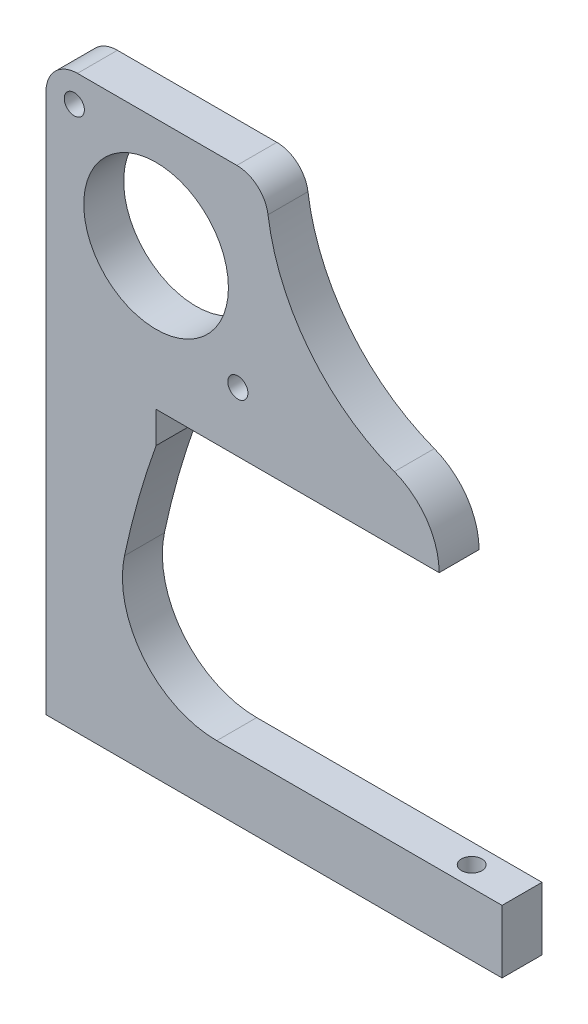
ISO-10303-21;
HEADER;
FILE_DESCRIPTION(('STEP AP214'),'2;1');
FILE_NAME('part.step','',(''),(''),'','','');
FILE_SCHEMA(('AUTOMOTIVE_DESIGN { 1 0 10303 214 1 1 1 1 }'));
ENDSEC;
DATA;
#1=APPLICATION_CONTEXT('core data for automotive mechanical design processes');
#2=APPLICATION_PROTOCOL_DEFINITION('international standard','automotive_design',2000,#1);
#3=PRODUCT_CONTEXT('',#1,'mechanical');
#4=PRODUCT('Part','Part','',(#3));
#5=PRODUCT_RELATED_PRODUCT_CATEGORY('part','',(#4));
#6=PRODUCT_DEFINITION_FORMATION('','',#4);
#7=PRODUCT_DEFINITION_CONTEXT('part definition',#1,'design');
#8=PRODUCT_DEFINITION('design','',#6,#7);
#9=PRODUCT_DEFINITION_SHAPE('','',#8);
#10=(LENGTH_UNIT() NAMED_UNIT(*) SI_UNIT(.MILLI.,.METRE.));
#11=(NAMED_UNIT(*) PLANE_ANGLE_UNIT() SI_UNIT($,.RADIAN.));
#12=(NAMED_UNIT(*) SI_UNIT($,.STERADIAN.) SOLID_ANGLE_UNIT());
#13=UNCERTAINTY_MEASURE_WITH_UNIT(LENGTH_MEASURE(1.E-05),#10,'distance_accuracy_value','');
#14=(GEOMETRIC_REPRESENTATION_CONTEXT(3) GLOBAL_UNCERTAINTY_ASSIGNED_CONTEXT((#13)) GLOBAL_UNIT_ASSIGNED_CONTEXT((#10,
#11,#12)) REPRESENTATION_CONTEXT('',''));
#15=CARTESIAN_POINT('',(0.,0.,0.));
#16=DIRECTION('',(0.,0.,1.));
#17=DIRECTION('',(1.,0.,0.));
#18=AXIS2_PLACEMENT_3D('',#15,#16,#17);
#19=CARTESIAN_POINT('',(0.,-40.,6.35));
#20=DIRECTION('',(0.,1.,0.));
#21=DIRECTION('',(0.,0.,1.));
#22=AXIS2_PLACEMENT_3D('',#19,#20,#21);
#23=PLANE('',#22);
#24=CARTESIAN_POINT('',(22.58,-40.,3.175));
#25=DIRECTION('',(0.,-1.,0.));
#26=DIRECTION('',(0.,0.,-1.));
#27=AXIS2_PLACEMENT_3D('',#24,#25,#26);
#28=CIRCLE('',#27,1.625);
#29=CARTESIAN_POINT('',(22.58,-40.,1.55));
#30=VERTEX_POINT('',#29);
#31=EDGE_CURVE('E187',#30,#30,#28,.T.);
#32=ORIENTED_EDGE('',*,*,#31,.F.);
#33=EDGE_LOOP('',(#32));
#34=FACE_BOUND('',#33,.T.);
#35=CARTESIAN_POINT('',(47.98,-40.,3.175));
#36=DIRECTION('',(0.,-1.,0.));
#37=DIRECTION('',(0.,0.,-1.));
#38=AXIS2_PLACEMENT_3D('',#35,#36,#37);
#39=CIRCLE('',#38,1.625);
#40=CARTESIAN_POINT('',(47.98,-40.,1.55));
#41=VERTEX_POINT('',#40);
#42=EDGE_CURVE('E214',#41,#41,#39,.T.);
#43=ORIENTED_EDGE('',*,*,#42,.F.);
#44=EDGE_LOOP('',(#43));
#45=FACE_BOUND('',#44,.T.);
#46=DIRECTION('',(1.,0.,0.));
#47=VECTOR('',#46,1.);
#48=CARTESIAN_POINT('',(0.,-40.,0.));
#49=LINE('',#48,#47);
#50=CARTESIAN_POINT('',(17.5,-40.,0.));
#51=VERTEX_POINT('',#50);
#52=CARTESIAN_POINT('',(62.5,-40.,0.));
#53=VERTEX_POINT('',#52);
#54=EDGE_CURVE('E273',#51,#53,#49,.T.);
#55=ORIENTED_EDGE('',*,*,#54,.T.);
#56=DIRECTION('',(0.,0.,-1.));
#57=VECTOR('',#56,1.);
#58=CARTESIAN_POINT('',(62.5,-40.,6.35));
#59=LINE('',#58,#57);
#60=CARTESIAN_POINT('',(62.5,-40.,6.35));
#61=VERTEX_POINT('',#60);
#62=EDGE_CURVE('E316',#61,#53,#59,.T.);
#63=ORIENTED_EDGE('',*,*,#62,.F.);
#64=DIRECTION('',(1.,0.,0.));
#65=VECTOR('',#64,1.);
#66=CARTESIAN_POINT('',(0.,-40.,6.35));
#67=LINE('',#66,#65);
#68=CARTESIAN_POINT('',(17.5,-40.,6.35));
#69=VERTEX_POINT('',#68);
#70=EDGE_CURVE('E236',#69,#61,#67,.T.);
#71=ORIENTED_EDGE('',*,*,#70,.F.);
#72=DIRECTION('',(0.,0.,-1.));
#73=VECTOR('',#72,1.);
#74=CARTESIAN_POINT('',(17.5,-40.,6.35));
#75=LINE('',#74,#73);
#76=EDGE_CURVE('E261',#69,#51,#75,.T.);
#77=ORIENTED_EDGE('',*,*,#76,.T.);
#78=EDGE_LOOP('',(#55,#63,#71,#77));
#79=FACE_BOUND('',#78,.T.);
#80=ADVANCED_FACE('F64',(#34,#45,#79),#23,.F.);
#81=CARTESIAN_POINT('',(51.409090909091,-40.,6.35));
#82=DIRECTION('',(0.,0.,-1.));
#83=DIRECTION('',(-1.,0.,0.));
#84=AXIS2_PLACEMENT_3D('',#81,#82,#83);
#85=CYLINDRICAL_SURFACE('',#84,11.090909090909);
#86=CARTESIAN_POINT('',(51.409090909091,-40.,0.));
#87=DIRECTION('',(0.,0.,1.));
#88=DIRECTION('',(1.,0.,0.));
#89=AXIS2_PLACEMENT_3D('',#86,#87,#88);
#90=CIRCLE('',#89,11.090909090909);
#91=CARTESIAN_POINT('',(55.3806366047746,-29.6445623342175,0.));
#92=VERTEX_POINT('',#91);
#93=EDGE_CURVE('E276',#53,#92,#90,.T.);
#94=ORIENTED_EDGE('',*,*,#93,.T.);
#95=DIRECTION('',(0.,0.,-1.));
#96=VECTOR('',#95,1.);
#97=CARTESIAN_POINT('',(55.3806366047746,-29.6445623342175,6.35));
#98=LINE('',#97,#96);
#99=CARTESIAN_POINT('',(55.3806366047746,-29.6445623342175,6.35));
#100=VERTEX_POINT('',#99);
#101=EDGE_CURVE('E312',#100,#92,#98,.T.);
#102=ORIENTED_EDGE('',*,*,#101,.F.);
#103=CARTESIAN_POINT('',(51.409090909091,-40.,6.35));
#104=DIRECTION('',(0.,0.,1.));
#105=DIRECTION('',(1.,0.,0.));
#106=AXIS2_PLACEMENT_3D('',#103,#104,#105);
#107=CIRCLE('',#106,11.090909090909);
#108=EDGE_CURVE('E240',#61,#100,#107,.T.);
#109=ORIENTED_EDGE('',*,*,#108,.F.);
#110=ORIENTED_EDGE('',*,*,#62,.T.);
#111=EDGE_LOOP('',(#94,#102,#109,#110));
#112=FACE_BOUND('',#111,.T.);
#113=ADVANCED_FACE('F370',(#112),#85,.T.);
#114=CARTESIAN_POINT('',(66.75,0.,6.35));
#115=DIRECTION('',(0.,0.,-1.));
#116=DIRECTION('',(-1.,0.,0.));
#117=AXIS2_PLACEMENT_3D('',#114,#115,#116);
#118=CYLINDRICAL_SURFACE('',#117,31.75);
#119=CARTESIAN_POINT('',(66.75,0.,0.));
#120=DIRECTION('',(0.,0.,1.));
#121=DIRECTION('',(1.,0.,0.));
#122=AXIS2_PLACEMENT_3D('',#119,#120,#121);
#123=CIRCLE('',#122,31.75);
#124=CARTESIAN_POINT('',(35.295231665988,-4.31972789115646,0.));
#125=VERTEX_POINT('',#124);
#126=EDGE_CURVE('E280',#125,#92,#123,.T.);
#127=ORIENTED_EDGE('',*,*,#126,.F.);
#128=DIRECTION('',(0.,0.,-1.));
#129=VECTOR('',#128,1.);
#130=CARTESIAN_POINT('',(35.295231665988,-4.31972789115646,6.35));
#131=LINE('',#130,#129);
#132=CARTESIAN_POINT('',(35.295231665988,-4.31972789115646,6.35));
#133=VERTEX_POINT('',#132);
#134=EDGE_CURVE('E11',#125,#133,#131,.F.);
#135=ORIENTED_EDGE('',*,*,#134,.T.);
#136=CARTESIAN_POINT('',(66.75,0.,6.35));
#137=DIRECTION('',(0.,0.,1.));
#138=DIRECTION('',(1.,0.,0.));
#139=AXIS2_PLACEMENT_3D('',#136,#137,#138);
#140=CIRCLE('',#139,31.75);
#141=EDGE_CURVE('E244',#133,#100,#140,.T.);
#142=ORIENTED_EDGE('',*,*,#141,.T.);
#143=ORIENTED_EDGE('',*,*,#101,.T.);
#144=EDGE_LOOP('',(#127,#135,#142,#143));
#145=FACE_BOUND('',#144,.T.);
#146=ADVANCED_FACE('F367',(#145),#118,.F.);
#147=CARTESIAN_POINT('',(0.,0.,6.35));
#148=DIRECTION('',(0.,1.,0.));
#149=DIRECTION('',(0.,0.,1.));
#150=AXIS2_PLACEMENT_3D('',#147,#148,#149);
#151=PLANE('',#150);
#152=DIRECTION('',(1.,0.,0.));
#153=VECTOR('',#152,1.);
#154=CARTESIAN_POINT('',(0.,0.,0.));
#155=LINE('',#154,#153);
#156=CARTESIAN_POINT('',(5.,0.,0.));
#157=VERTEX_POINT('',#156);
#158=CARTESIAN_POINT('',(30.3417248417341,0.,0.));
#159=VERTEX_POINT('',#158);
#160=EDGE_CURVE('E283',#157,#159,#155,.T.);
#161=ORIENTED_EDGE('',*,*,#160,.F.);
#162=DIRECTION('',(0.,0.,-1.));
#163=VECTOR('',#162,1.);
#164=CARTESIAN_POINT('',(5.,0.,6.35));
#165=LINE('',#164,#163);
#166=CARTESIAN_POINT('',(5.,0.,6.35));
#167=VERTEX_POINT('',#166);
#168=EDGE_CURVE('E346',#157,#167,#165,.F.);
#169=ORIENTED_EDGE('',*,*,#168,.T.);
#170=DIRECTION('',(1.,0.,0.));
#171=VECTOR('',#170,1.);
#172=CARTESIAN_POINT('',(0.,0.,6.35));
#173=LINE('',#172,#171);
#174=CARTESIAN_POINT('',(30.3417248417341,0.,6.35));
#175=VERTEX_POINT('',#174);
#176=EDGE_CURVE('E247',#167,#175,#173,.T.);
#177=ORIENTED_EDGE('',*,*,#176,.T.);
#178=DIRECTION('',(0.,0.,-1.));
#179=VECTOR('',#178,1.);
#180=CARTESIAN_POINT('',(30.3417248417341,0.,6.35));
#181=LINE('',#180,#179);
#182=EDGE_CURVE('E342',#175,#159,#181,.T.);
#183=ORIENTED_EDGE('',*,*,#182,.T.);
#184=EDGE_LOOP('',(#161,#169,#177,#183));
#185=FACE_BOUND('',#184,.T.);
#186=ADVANCED_FACE('F364',(#185),#151,.T.);
#187=CARTESIAN_POINT('',(0.,0.,6.35));
#188=DIRECTION('',(-1.,0.,0.));
#189=DIRECTION('',(0.,0.,1.));
#190=AXIS2_PLACEMENT_3D('',#187,#188,#189);
#191=PLANE('',#190);
#192=DIRECTION('',(0.,1.,0.));
#193=VECTOR('',#192,1.);
#194=CARTESIAN_POINT('',(0.,0.,6.35));
#195=LINE('',#194,#193);
#196=CARTESIAN_POINT('',(0.,-90.8,6.35));
#197=VERTEX_POINT('',#196);
#198=CARTESIAN_POINT('',(0.,-5.,6.35));
#199=VERTEX_POINT('',#198);
#200=EDGE_CURVE('E173',#197,#199,#195,.T.);
#201=ORIENTED_EDGE('',*,*,#200,.T.);
#202=DIRECTION('',(0.,0.,-1.));
#203=VECTOR('',#202,1.);
#204=CARTESIAN_POINT('',(0.,-5.,6.35));
#205=LINE('',#204,#203);
#206=CARTESIAN_POINT('',(0.,-5.,0.));
#207=VERTEX_POINT('',#206);
#208=EDGE_CURVE('E332',#199,#207,#205,.T.);
#209=ORIENTED_EDGE('',*,*,#208,.T.);
#210=DIRECTION('',(0.,1.,0.));
#211=VECTOR('',#210,1.);
#212=CARTESIAN_POINT('',(0.,0.,0.));
#213=LINE('',#212,#211);
#214=CARTESIAN_POINT('',(0.,-90.8,0.));
#215=VERTEX_POINT('',#214);
#216=EDGE_CURVE('E287',#215,#207,#213,.T.);
#217=ORIENTED_EDGE('',*,*,#216,.F.);
#218=DIRECTION('',(0.,0.,-1.));
#219=VECTOR('',#218,1.);
#220=CARTESIAN_POINT('',(0.,-90.8,6.35));
#221=LINE('',#220,#219);
#222=EDGE_CURVE('E309',#197,#215,#221,.T.);
#223=ORIENTED_EDGE('',*,*,#222,.F.);
#224=EDGE_LOOP('',(#201,#209,#217,#223));
#225=FACE_BOUND('',#224,.T.);
#226=ADVANCED_FACE('F357',(#225),#191,.T.);
#227=CARTESIAN_POINT('',(0.,-90.8,6.35));
#228=DIRECTION('',(0.,-1.,0.));
#229=DIRECTION('',(0.,0.,-1.));
#230=AXIS2_PLACEMENT_3D('',#227,#228,#229);
#231=PLANE('',#230);
#232=CARTESIAN_POINT('',(64.5,-90.8,3.175));
#233=DIRECTION('',(0.,-1.,0.));
#234=DIRECTION('',(0.,0.,-1.));
#235=AXIS2_PLACEMENT_3D('',#232,#233,#234);
#236=CIRCLE('',#235,1.625);
#237=CARTESIAN_POINT('',(64.5,-90.8,1.55));
#238=VERTEX_POINT('',#237);
#239=EDGE_CURVE('E656',#238,#238,#236,.T.);
#240=ORIENTED_EDGE('',*,*,#239,.F.);
#241=EDGE_LOOP('',(#240));
#242=FACE_BOUND('',#241,.T.);
#243=DIRECTION('',(-1.,0.,0.));
#244=VECTOR('',#243,1.);
#245=CARTESIAN_POINT('',(0.,-90.8,0.));
#246=LINE('',#245,#244);
#247=CARTESIAN_POINT('',(72.5,-90.8,0.));
#248=VERTEX_POINT('',#247);
#249=EDGE_CURVE('E182',#248,#215,#246,.T.);
#250=ORIENTED_EDGE('',*,*,#249,.F.);
#251=DIRECTION('',(0.,0.,-1.));
#252=VECTOR('',#251,1.);
#253=CARTESIAN_POINT('',(72.5,-90.8,6.35));
#254=LINE('',#253,#252);
#255=CARTESIAN_POINT('',(72.5,-90.8,6.35));
#256=VERTEX_POINT('',#255);
#257=EDGE_CURVE('E179',#256,#248,#254,.T.);
#258=ORIENTED_EDGE('',*,*,#257,.F.);
#259=DIRECTION('',(-1.,0.,0.));
#260=VECTOR('',#259,1.);
#261=CARTESIAN_POINT('',(0.,-90.8,6.35));
#262=LINE('',#261,#260);
#263=EDGE_CURVE('E166',#256,#197,#262,.T.);
#264=ORIENTED_EDGE('',*,*,#263,.T.);
#265=ORIENTED_EDGE('',*,*,#222,.T.);
#266=EDGE_LOOP('',(#250,#258,#264,#265));
#267=FACE_BOUND('',#266,.T.);
#268=ADVANCED_FACE('F180',(#242,#267),#231,.T.);
#269=CARTESIAN_POINT('',(0.,-80.8,6.35));
#270=DIRECTION('',(0.,-1.,0.));
#271=DIRECTION('',(1.,0.,0.));
#272=AXIS2_PLACEMENT_3D('',#269,#270,#271);
#273=PLANE('',#272);
#274=CARTESIAN_POINT('',(64.5,-80.8,3.175));
#275=DIRECTION('',(0.,-1.,0.));
#276=DIRECTION('',(1.,0.,0.));
#277=AXIS2_PLACEMENT_3D('',#274,#275,#276);
#278=CIRCLE('',#277,1.625);
#279=CARTESIAN_POINT('',(66.125,-80.8,3.175));
#280=VERTEX_POINT('',#279);
#281=EDGE_CURVE('E202',#280,#280,#278,.F.);
#282=ORIENTED_EDGE('',*,*,#281,.F.);
#283=EDGE_LOOP('',(#282));
#284=FACE_BOUND('',#283,.T.);
#285=DIRECTION('',(-1.,0.,0.));
#286=VECTOR('',#285,1.);
#287=CARTESIAN_POINT('',(0.,-80.8,0.));
#288=LINE('',#287,#286);
#289=CARTESIAN_POINT('',(72.5,-80.8,0.));
#290=VERTEX_POINT('',#289);
#291=CARTESIAN_POINT('',(27.1468631938929,-80.8,0.));
#292=VERTEX_POINT('',#291);
#293=EDGE_CURVE('E293',#290,#292,#288,.T.);
#294=ORIENTED_EDGE('',*,*,#293,.T.);
#295=DIRECTION('',(0.,0.,1.));
#296=VECTOR('',#295,1.);
#297=CARTESIAN_POINT('',(27.1468631938929,-80.8,6.35));
#298=LINE('',#297,#296);
#299=CARTESIAN_POINT('',(27.1468631938929,-80.8,6.35));
#300=VERTEX_POINT('',#299);
#301=EDGE_CURVE('E323',#292,#300,#298,.T.);
#302=ORIENTED_EDGE('',*,*,#301,.T.);
#303=DIRECTION('',(-1.,0.,0.));
#304=VECTOR('',#303,1.);
#305=CARTESIAN_POINT('',(0.,-80.8,6.35));
#306=LINE('',#305,#304);
#307=CARTESIAN_POINT('',(72.5,-80.8,6.35));
#308=VERTEX_POINT('',#307);
#309=EDGE_CURVE('E176',#308,#300,#306,.T.);
#310=ORIENTED_EDGE('',*,*,#309,.F.);
#311=DIRECTION('',(0.,0.,-1.));
#312=VECTOR('',#311,1.);
#313=CARTESIAN_POINT('',(72.5,-80.8,6.35));
#314=LINE('',#313,#312);
#315=EDGE_CURVE('E188',#308,#290,#314,.T.);
#316=ORIENTED_EDGE('',*,*,#315,.T.);
#317=EDGE_LOOP('',(#294,#302,#310,#316));
#318=FACE_BOUND('',#317,.T.);
#319=ADVANCED_FACE('F388',(#284,#318),#273,.F.);
#320=CARTESIAN_POINT('',(145.025979623825,-90.8,6.35));
#321=DIRECTION('',(0.,0.,-1.));
#322=DIRECTION('',(-1.,0.,0.));
#323=AXIS2_PLACEMENT_3D('',#320,#321,#322);
#324=CYLINDRICAL_SURFACE('',#323,135.500979623825);
#325=CARTESIAN_POINT('',(145.025979623825,-90.8,6.35));
#326=DIRECTION('',(0.,0.,1.));
#327=DIRECTION('',(1.,0.,0.));
#328=AXIS2_PLACEMENT_3D('',#325,#326,#327);
#329=CIRCLE('',#328,135.500979623825);
#330=CARTESIAN_POINT('',(12.4732335523013,-62.6879921045401,6.35));
#331=VERTEX_POINT('',#330);
#332=CARTESIAN_POINT('',(17.5,-45.,6.35));
#333=VERTEX_POINT('',#332);
#334=EDGE_CURVE('E254',#331,#333,#329,.F.);
#335=ORIENTED_EDGE('',*,*,#334,.F.);
#336=DIRECTION('',(0.,0.,-1.));
#337=VECTOR('',#336,1.);
#338=CARTESIAN_POINT('',(12.4732335523013,-62.6879921045401,6.35));
#339=LINE('',#338,#337);
#340=CARTESIAN_POINT('',(12.4732335523013,-62.6879921045401,0.));
#341=VERTEX_POINT('',#340);
#342=EDGE_CURVE('E320',#331,#341,#339,.T.);
#343=ORIENTED_EDGE('',*,*,#342,.T.);
#344=CARTESIAN_POINT('',(145.025979623825,-90.8,0.));
#345=DIRECTION('',(0.,0.,1.));
#346=DIRECTION('',(1.,0.,0.));
#347=AXIS2_PLACEMENT_3D('',#344,#345,#346);
#348=CIRCLE('',#347,135.500979623825);
#349=CARTESIAN_POINT('',(17.5,-45.,0.));
#350=VERTEX_POINT('',#349);
#351=EDGE_CURVE('E297',#341,#350,#348,.F.);
#352=ORIENTED_EDGE('',*,*,#351,.T.);
#353=DIRECTION('',(0.,0.,-1.));
#354=VECTOR('',#353,1.);
#355=CARTESIAN_POINT('',(17.5,-45.,6.35));
#356=LINE('',#355,#354);
#357=EDGE_CURVE('E305',#333,#350,#356,.T.);
#358=ORIENTED_EDGE('',*,*,#357,.F.);
#359=EDGE_LOOP('',(#335,#343,#352,#358));
#360=FACE_BOUND('',#359,.T.);
#361=ADVANCED_FACE('F383',(#360),#324,.F.);
#362=CARTESIAN_POINT('',(30.5,-30.5,6.35));
#363=DIRECTION('',(0.,0.,-1.));
#364=DIRECTION('',(-1.,0.,0.));
#365=AXIS2_PLACEMENT_3D('',#362,#363,#364);
#366=CYLINDRICAL_SURFACE('',#365,1.6002);
#367=CARTESIAN_POINT('',(30.5,-30.5,6.35));
#368=DIRECTION('',(0.,0.,1.));
#369=DIRECTION('',(1.,0.,0.));
#370=AXIS2_PLACEMENT_3D('',#367,#368,#369);
#371=CIRCLE('',#370,1.6002);
#372=CARTESIAN_POINT('',(32.1002,-30.5,6.35));
#373=VERTEX_POINT('',#372);
#374=EDGE_CURVE('E232',#373,#373,#371,.T.);
#375=ORIENTED_EDGE('',*,*,#374,.T.);
#376=EDGE_LOOP('',(#375));
#377=FACE_BOUND('',#376,.T.);
#378=CARTESIAN_POINT('',(30.5,-30.5,0.));
#379=DIRECTION('',(0.,0.,1.));
#380=DIRECTION('',(1.,0.,0.));
#381=AXIS2_PLACEMENT_3D('',#378,#379,#380);
#382=CIRCLE('',#381,1.6002);
#383=CARTESIAN_POINT('',(32.1002,-30.5,0.));
#384=VERTEX_POINT('',#383);
#385=EDGE_CURVE('E269',#384,#384,#382,.T.);
#386=ORIENTED_EDGE('',*,*,#385,.F.);
#387=EDGE_LOOP('',(#386));
#388=FACE_BOUND('',#387,.T.);
#389=ADVANCED_FACE('F401',(#377,#388),#366,.F.);
#390=CARTESIAN_POINT('',(17.5,-17.5,6.35));
#391=DIRECTION('',(0.,0.,-1.));
#392=DIRECTION('',(-1.,0.,0.));
#393=AXIS2_PLACEMENT_3D('',#390,#391,#392);
#394=CYLINDRICAL_SURFACE('',#393,11.5);
#395=CARTESIAN_POINT('',(17.5,-17.5,6.35));
#396=DIRECTION('',(0.,0.,1.));
#397=DIRECTION('',(1.,0.,0.));
#398=AXIS2_PLACEMENT_3D('',#395,#396,#397);
#399=CIRCLE('',#398,11.5);
#400=CARTESIAN_POINT('',(29.,-17.5,6.35));
#401=VERTEX_POINT('',#400);
#402=EDGE_CURVE('E227',#401,#401,#399,.T.);
#403=ORIENTED_EDGE('',*,*,#402,.T.);
#404=EDGE_LOOP('',(#403));
#405=FACE_BOUND('',#404,.T.);
#406=CARTESIAN_POINT('',(17.5,-17.5,0.));
#407=DIRECTION('',(0.,0.,1.));
#408=DIRECTION('',(1.,0.,0.));
#409=AXIS2_PLACEMENT_3D('',#406,#407,#408);
#410=CIRCLE('',#409,11.5);
#411=CARTESIAN_POINT('',(29.,-17.5,0.));
#412=VERTEX_POINT('',#411);
#413=EDGE_CURVE('E265',#412,#412,#410,.T.);
#414=ORIENTED_EDGE('',*,*,#413,.F.);
#415=EDGE_LOOP('',(#414));
#416=FACE_BOUND('',#415,.T.);
#417=ADVANCED_FACE('F404',(#405,#416),#394,.F.);
#418=CARTESIAN_POINT('',(4.5,-4.5,6.35));
#419=DIRECTION('',(0.,0.,-1.));
#420=DIRECTION('',(-1.,0.,0.));
#421=AXIS2_PLACEMENT_3D('',#418,#419,#420);
#422=CYLINDRICAL_SURFACE('',#421,1.6002);
#423=CARTESIAN_POINT('',(4.5,-4.5,6.35));
#424=DIRECTION('',(0.,0.,1.));
#425=DIRECTION('',(1.,0.,0.));
#426=AXIS2_PLACEMENT_3D('',#423,#424,#425);
#427=CIRCLE('',#426,1.6002);
#428=CARTESIAN_POINT('',(6.1002,-4.5,6.35));
#429=VERTEX_POINT('',#428);
#430=EDGE_CURVE('E223',#429,#429,#427,.T.);
#431=ORIENTED_EDGE('',*,*,#430,.T.);
#432=EDGE_LOOP('',(#431));
#433=FACE_BOUND('',#432,.T.);
#434=CARTESIAN_POINT('',(4.5,-4.5,0.));
#435=DIRECTION('',(0.,0.,1.));
#436=DIRECTION('',(1.,0.,0.));
#437=AXIS2_PLACEMENT_3D('',#434,#435,#436);
#438=CIRCLE('',#437,1.6002);
#439=CARTESIAN_POINT('',(6.1002,-4.5,0.));
#440=VERTEX_POINT('',#439);
#441=EDGE_CURVE('E222',#440,#440,#438,.T.);
#442=ORIENTED_EDGE('',*,*,#441,.F.);
#443=EDGE_LOOP('',(#442));
#444=FACE_BOUND('',#443,.T.);
#445=ADVANCED_FACE('F408',(#433,#444),#422,.F.);
#446=CARTESIAN_POINT('',(17.5,0.,6.35));
#447=DIRECTION('',(1.,0.,0.));
#448=DIRECTION('',(0.,1.,0.));
#449=AXIS2_PLACEMENT_3D('',#446,#447,#448);
#450=PLANE('',#449);
#451=DIRECTION('',(0.,-1.,0.));
#452=VECTOR('',#451,1.);
#453=CARTESIAN_POINT('',(17.5,0.,0.));
#454=LINE('',#453,#452);
#455=EDGE_CURVE('E228',#51,#350,#454,.T.);
#456=ORIENTED_EDGE('',*,*,#455,.F.);
#457=ORIENTED_EDGE('',*,*,#76,.F.);
#458=DIRECTION('',(0.,-1.,0.));
#459=VECTOR('',#458,1.);
#460=CARTESIAN_POINT('',(17.5,0.,6.35));
#461=LINE('',#460,#459);
#462=EDGE_CURVE('E257',#69,#333,#461,.T.);
#463=ORIENTED_EDGE('',*,*,#462,.T.);
#464=ORIENTED_EDGE('',*,*,#357,.T.);
#465=EDGE_LOOP('',(#456,#457,#463,#464));
#466=FACE_BOUND('',#465,.T.);
#467=ADVANCED_FACE('F377',(#466),#450,.T.);
#468=CARTESIAN_POINT('',(0.,0.,6.35));
#469=DIRECTION('',(0.,0.,1.));
#470=DIRECTION('',(1.,0.,0.));
#471=AXIS2_PLACEMENT_3D('',#468,#469,#470);
#472=PLANE('',#471);
#473=ORIENTED_EDGE('',*,*,#430,.F.);
#474=EDGE_LOOP('',(#473));
#475=FACE_BOUND('',#474,.T.);
#476=ORIENTED_EDGE('',*,*,#402,.F.);
#477=EDGE_LOOP('',(#476));
#478=FACE_BOUND('',#477,.T.);
#479=ORIENTED_EDGE('',*,*,#374,.F.);
#480=EDGE_LOOP('',(#479));
#481=FACE_BOUND('',#480,.T.);
#482=ORIENTED_EDGE('',*,*,#176,.F.);
#483=CARTESIAN_POINT('',(5.,-5.,6.35));
#484=DIRECTION('',(0.,0.,1.));
#485=DIRECTION('',(1.,0.,0.));
#486=AXIS2_PLACEMENT_3D('',#483,#484,#485);
#487=CIRCLE('',#486,5.);
#488=EDGE_CURVE('E73',#167,#199,#487,.T.);
#489=ORIENTED_EDGE('',*,*,#488,.T.);
#490=ORIENTED_EDGE('',*,*,#200,.F.);
#491=ORIENTED_EDGE('',*,*,#263,.F.);
#492=DIRECTION('',(0.,-1.,0.));
#493=VECTOR('',#492,1.);
#494=CARTESIAN_POINT('',(72.5,0.,6.35));
#495=LINE('',#494,#493);
#496=EDGE_CURVE('E171',#308,#256,#495,.T.);
#497=ORIENTED_EDGE('',*,*,#496,.F.);
#498=ORIENTED_EDGE('',*,*,#309,.T.);
#499=CARTESIAN_POINT('',(27.1468631938929,-65.8,6.35));
#500=DIRECTION('',(0.,0.,1.));
#501=DIRECTION('',(1.,0.,0.));
#502=AXIS2_PLACEMENT_3D('',#499,#500,#501);
#503=CIRCLE('',#502,15.);
#504=EDGE_CURVE('E329',#300,#331,#503,.F.);
#505=ORIENTED_EDGE('',*,*,#504,.T.);
#506=ORIENTED_EDGE('',*,*,#334,.T.);
#507=ORIENTED_EDGE('',*,*,#462,.F.);
#508=ORIENTED_EDGE('',*,*,#70,.T.);
#509=ORIENTED_EDGE('',*,*,#108,.T.);
#510=ORIENTED_EDGE('',*,*,#141,.F.);
#511=CARTESIAN_POINT('',(30.3417248417341,-5.,6.35));
#512=DIRECTION('',(0.,0.,1.));
#513=DIRECTION('',(1.,0.,0.));
#514=AXIS2_PLACEMENT_3D('',#511,#512,#513);
#515=CIRCLE('',#514,5.);
#516=EDGE_CURVE('E85',#133,#175,#515,.T.);
#517=ORIENTED_EDGE('',*,*,#516,.T.);
#518=EDGE_LOOP('',(#482,#489,#490,#491,#497,#498,#505,#506,#507,#508,#509,#510,#517));
#519=FACE_BOUND('',#518,.T.);
#520=ADVANCED_FACE('F168',(#475,#478,#481,#519),#472,.T.);
#521=CARTESIAN_POINT('',(0.,0.,0.));
#522=DIRECTION('',(0.,0.,1.));
#523=DIRECTION('',(1.,0.,0.));
#524=AXIS2_PLACEMENT_3D('',#521,#522,#523);
#525=PLANE('',#524);
#526=ORIENTED_EDGE('',*,*,#441,.T.);
#527=EDGE_LOOP('',(#526));
#528=FACE_BOUND('',#527,.T.);
#529=ORIENTED_EDGE('',*,*,#413,.T.);
#530=EDGE_LOOP('',(#529));
#531=FACE_BOUND('',#530,.T.);
#532=ORIENTED_EDGE('',*,*,#385,.T.);
#533=EDGE_LOOP('',(#532));
#534=FACE_BOUND('',#533,.T.);
#535=ORIENTED_EDGE('',*,*,#216,.T.);
#536=CARTESIAN_POINT('',(5.,-5.,0.));
#537=DIRECTION('',(0.,0.,1.));
#538=DIRECTION('',(1.,0.,0.));
#539=AXIS2_PLACEMENT_3D('',#536,#537,#538);
#540=CIRCLE('',#539,5.);
#541=EDGE_CURVE('E339',#207,#157,#540,.F.);
#542=ORIENTED_EDGE('',*,*,#541,.T.);
#543=ORIENTED_EDGE('',*,*,#160,.T.);
#544=CARTESIAN_POINT('',(30.3417248417341,-5.,0.));
#545=DIRECTION('',(0.,0.,1.));
#546=DIRECTION('',(1.,0.,0.));
#547=AXIS2_PLACEMENT_3D('',#544,#545,#546);
#548=CIRCLE('',#547,5.);
#549=EDGE_CURVE('E336',#159,#125,#548,.F.);
#550=ORIENTED_EDGE('',*,*,#549,.T.);
#551=ORIENTED_EDGE('',*,*,#126,.T.);
#552=ORIENTED_EDGE('',*,*,#93,.F.);
#553=ORIENTED_EDGE('',*,*,#54,.F.);
#554=ORIENTED_EDGE('',*,*,#455,.T.);
#555=ORIENTED_EDGE('',*,*,#351,.F.);
#556=CARTESIAN_POINT('',(27.1468631938929,-65.8,0.));
#557=DIRECTION('',(0.,0.,1.));
#558=DIRECTION('',(1.,0.,0.));
#559=AXIS2_PLACEMENT_3D('',#556,#557,#558);
#560=CIRCLE('',#559,15.);
#561=EDGE_CURVE('E326',#341,#292,#560,.T.);
#562=ORIENTED_EDGE('',*,*,#561,.T.);
#563=ORIENTED_EDGE('',*,*,#293,.F.);
#564=DIRECTION('',(0.,-1.,0.));
#565=VECTOR('',#564,1.);
#566=CARTESIAN_POINT('',(72.5,0.,0.));
#567=LINE('',#566,#565);
#568=EDGE_CURVE('E194',#290,#248,#567,.T.);
#569=ORIENTED_EDGE('',*,*,#568,.T.);
#570=ORIENTED_EDGE('',*,*,#249,.T.);
#571=EDGE_LOOP('',(#535,#542,#543,#550,#551,#552,#553,#554,#555,#562,#563,#569,#570));
#572=FACE_BOUND('',#571,.T.);
#573=ADVANCED_FACE('F362',(#528,#531,#534,#572),#525,.F.);
#574=CARTESIAN_POINT('',(47.98,-30.,3.175));
#575=DIRECTION('',(0.,-1.,0.));
#576=DIRECTION('',(0.,0.,-1.));
#577=AXIS2_PLACEMENT_3D('',#574,#575,#576);
#578=CONICAL_SURFACE('',#577,1.62499999999999,1.02974425867665);
#579=CARTESIAN_POINT('',(47.98,-29.0236014940802,3.175));
#580=VERTEX_POINT('',#579);
#581=VERTEX_LOOP('',#580);
#582=FACE_BOUND('',#581,.T.);
#583=CARTESIAN_POINT('',(47.98,-30.,3.175));
#584=DIRECTION('',(0.,-1.,0.));
#585=DIRECTION('',(0.,0.,-1.));
#586=AXIS2_PLACEMENT_3D('',#583,#584,#585);
#587=CIRCLE('',#586,1.62499999999999);
#588=CARTESIAN_POINT('',(47.98,-30.,1.55000000000001));
#589=VERTEX_POINT('',#588);
#590=EDGE_CURVE('E218',#589,#589,#587,.T.);
#591=ORIENTED_EDGE('',*,*,#590,.T.);
#592=EDGE_LOOP('',(#591));
#593=FACE_BOUND('',#592,.T.);
#594=ADVANCED_FACE('F438',(#582,#593),#578,.F.);
#595=CARTESIAN_POINT('',(47.98,-40.,3.175));
#596=DIRECTION('',(0.,-1.,0.));
#597=DIRECTION('',(0.,0.,-1.));
#598=AXIS2_PLACEMENT_3D('',#595,#596,#597);
#599=CYLINDRICAL_SURFACE('',#598,1.625);
#600=ORIENTED_EDGE('',*,*,#590,.F.);
#601=EDGE_LOOP('',(#600));
#602=FACE_BOUND('',#601,.T.);
#603=ORIENTED_EDGE('',*,*,#42,.T.);
#604=EDGE_LOOP('',(#603));
#605=FACE_BOUND('',#604,.T.);
#606=ADVANCED_FACE('F434',(#602,#605),#599,.F.);
#607=CARTESIAN_POINT('',(22.58,-30.,3.175));
#608=DIRECTION('',(0.,-1.,0.));
#609=DIRECTION('',(0.,0.,-1.));
#610=AXIS2_PLACEMENT_3D('',#607,#608,#609);
#611=CONICAL_SURFACE('',#610,1.625,1.02974425867665);
#612=CARTESIAN_POINT('',(22.58,-29.0236014940802,3.175));
#613=VERTEX_POINT('',#612);
#614=VERTEX_LOOP('',#613);
#615=FACE_BOUND('',#614,.T.);
#616=CARTESIAN_POINT('',(22.58,-30.,3.175));
#617=DIRECTION('',(0.,-1.,0.));
#618=DIRECTION('',(0.,0.,-1.));
#619=AXIS2_PLACEMENT_3D('',#616,#617,#618);
#620=CIRCLE('',#619,1.625);
#621=CARTESIAN_POINT('',(22.58,-30.,1.55));
#622=VERTEX_POINT('',#621);
#623=EDGE_CURVE('E210',#622,#622,#620,.T.);
#624=ORIENTED_EDGE('',*,*,#623,.T.);
#625=EDGE_LOOP('',(#624));
#626=FACE_BOUND('',#625,.T.);
#627=ADVANCED_FACE('F430',(#615,#626),#611,.F.);
#628=CARTESIAN_POINT('',(22.58,-40.,3.175));
#629=DIRECTION('',(0.,-1.,0.));
#630=DIRECTION('',(0.,0.,-1.));
#631=AXIS2_PLACEMENT_3D('',#628,#629,#630);
#632=CYLINDRICAL_SURFACE('',#631,1.625);
#633=ORIENTED_EDGE('',*,*,#623,.F.);
#634=EDGE_LOOP('',(#633));
#635=FACE_BOUND('',#634,.T.);
#636=ORIENTED_EDGE('',*,*,#31,.T.);
#637=EDGE_LOOP('',(#636));
#638=FACE_BOUND('',#637,.T.);
#639=ADVANCED_FACE('F414',(#635,#638),#632,.F.);
#640=CARTESIAN_POINT('',(27.1468631938929,-65.8,6.35));
#641=DIRECTION('',(0.,0.,-1.));
#642=DIRECTION('',(-1.,0.,0.));
#643=AXIS2_PLACEMENT_3D('',#640,#641,#642);
#644=CYLINDRICAL_SURFACE('',#643,15.);
#645=ORIENTED_EDGE('',*,*,#504,.F.);
#646=ORIENTED_EDGE('',*,*,#301,.F.);
#647=ORIENTED_EDGE('',*,*,#561,.F.);
#648=ORIENTED_EDGE('',*,*,#342,.F.);
#649=EDGE_LOOP('',(#645,#646,#647,#648));
#650=FACE_BOUND('',#649,.T.);
#651=ADVANCED_FACE('F390',(#650),#644,.F.);
#652=CARTESIAN_POINT('',(72.5,0.,6.35));
#653=DIRECTION('',(1.,0.,0.));
#654=DIRECTION('',(0.,0.,-1.));
#655=AXIS2_PLACEMENT_3D('',#652,#653,#654);
#656=PLANE('',#655);
#657=ORIENTED_EDGE('',*,*,#568,.F.);
#658=ORIENTED_EDGE('',*,*,#315,.F.);
#659=ORIENTED_EDGE('',*,*,#496,.T.);
#660=ORIENTED_EDGE('',*,*,#257,.T.);
#661=EDGE_LOOP('',(#657,#658,#659,#660));
#662=FACE_BOUND('',#661,.T.);
#663=ADVANCED_FACE('F191',(#662),#656,.T.);
#664=CARTESIAN_POINT('',(64.5,0.001000000000001,3.175));
#665=DIRECTION('',(0.,-1.,0.));
#666=DIRECTION('',(0.,0.,-1.));
#667=AXIS2_PLACEMENT_3D('',#664,#665,#666);
#668=CYLINDRICAL_SURFACE('',#667,1.625);
#669=ORIENTED_EDGE('',*,*,#239,.T.);
#670=EDGE_LOOP('',(#669));
#671=FACE_BOUND('',#670,.T.);
#672=ORIENTED_EDGE('',*,*,#281,.T.);
#673=EDGE_LOOP('',(#672));
#674=FACE_BOUND('',#673,.T.);
#675=ADVANCED_FACE('F416',(#671,#674),#668,.F.);
#676=CARTESIAN_POINT('',(5.,-5.,6.35));
#677=DIRECTION('',(0.,0.,-1.));
#678=DIRECTION('',(-1.,0.,0.));
#679=AXIS2_PLACEMENT_3D('',#676,#677,#678);
#680=CYLINDRICAL_SURFACE('',#679,5.);
#681=ORIENTED_EDGE('',*,*,#488,.F.);
#682=ORIENTED_EDGE('',*,*,#168,.F.);
#683=ORIENTED_EDGE('',*,*,#541,.F.);
#684=ORIENTED_EDGE('',*,*,#208,.F.);
#685=EDGE_LOOP('',(#681,#682,#683,#684));
#686=FACE_BOUND('',#685,.T.);
#687=ADVANCED_FACE('F359',(#686),#680,.T.);
#688=CARTESIAN_POINT('',(30.3417248417341,-5.,6.35));
#689=DIRECTION('',(0.,0.,-1.));
#690=DIRECTION('',(-1.,0.,0.));
#691=AXIS2_PLACEMENT_3D('',#688,#689,#690);
#692=CYLINDRICAL_SURFACE('',#691,5.);
#693=ORIENTED_EDGE('',*,*,#516,.F.);
#694=ORIENTED_EDGE('',*,*,#134,.F.);
#695=ORIENTED_EDGE('',*,*,#549,.F.);
#696=ORIENTED_EDGE('',*,*,#182,.F.);
#697=EDGE_LOOP('',(#693,#694,#695,#696));
#698=FACE_BOUND('',#697,.T.);
#699=ADVANCED_FACE('F66',(#698),#692,.T.);
#700=CLOSED_SHELL('',(#80,#113,#146,#186,#226,#268,#319,#361,#389,#417,#445,#467,#520,#573,#594,
#606,#627,#639,#651,#663,#675,#687,#699));
#701=MANIFOLD_SOLID_BREP('B2',#700);
#702=ADVANCED_BREP_SHAPE_REPRESENTATION('',(#18,#701),#14);
#703=SHAPE_DEFINITION_REPRESENTATION(#9,#702);
ENDSEC;
END-ISO-10303-21;
